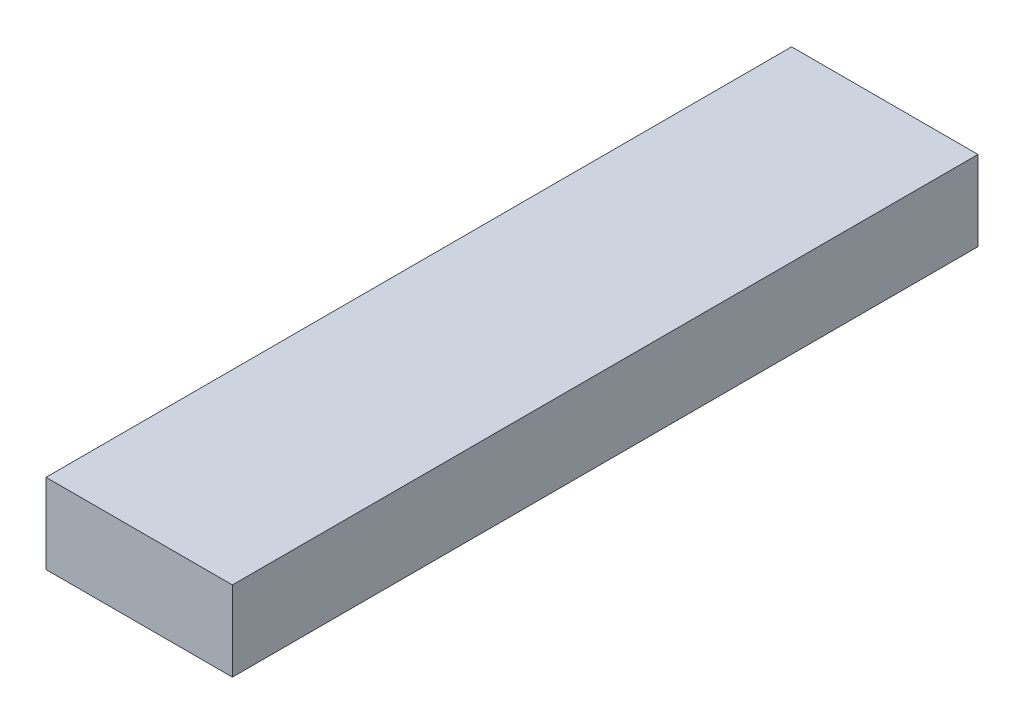
ISO-10303-21;
HEADER;
FILE_DESCRIPTION(('STEP AP214'),'2;1');
FILE_NAME('part.step','',(''),(''),'','','');
FILE_SCHEMA(('AUTOMOTIVE_DESIGN { 1 0 10303 214 1 1 1 1 }'));
ENDSEC;
DATA;
#1=APPLICATION_CONTEXT('core data for automotive mechanical design processes');
#2=APPLICATION_PROTOCOL_DEFINITION('international standard','automotive_design',2000,#1);
#3=PRODUCT_CONTEXT('',#1,'mechanical');
#4=PRODUCT('Part','Part','',(#3));
#5=PRODUCT_RELATED_PRODUCT_CATEGORY('part','',(#4));
#6=PRODUCT_DEFINITION_FORMATION('','',#4);
#7=PRODUCT_DEFINITION_CONTEXT('part definition',#1,'design');
#8=PRODUCT_DEFINITION('design','',#6,#7);
#9=PRODUCT_DEFINITION_SHAPE('','',#8);
#10=(LENGTH_UNIT() NAMED_UNIT(*) SI_UNIT(.MILLI.,.METRE.));
#11=(NAMED_UNIT(*) PLANE_ANGLE_UNIT() SI_UNIT($,.RADIAN.));
#12=(NAMED_UNIT(*) SI_UNIT($,.STERADIAN.) SOLID_ANGLE_UNIT());
#13=UNCERTAINTY_MEASURE_WITH_UNIT(LENGTH_MEASURE(1.E-05),#10,'distance_accuracy_value','');
#14=(GEOMETRIC_REPRESENTATION_CONTEXT(3) GLOBAL_UNCERTAINTY_ASSIGNED_CONTEXT((#13)) GLOBAL_UNIT_ASSIGNED_CONTEXT((#10,
#11,#12)) REPRESENTATION_CONTEXT('',''));
#15=CARTESIAN_POINT('',(0.,0.,0.));
#16=DIRECTION('',(0.,0.,1.));
#17=DIRECTION('',(1.,0.,0.));
#18=AXIS2_PLACEMENT_3D('',#15,#16,#17);
#19=CARTESIAN_POINT('',(0.,0.,355.6));
#20=DIRECTION('',(1.,0.,0.));
#21=DIRECTION('',(0.,0.,-1.));
#22=AXIS2_PLACEMENT_3D('',#19,#20,#21);
#23=PLANE('',#22);
#24=DIRECTION('',(0.,-1.,0.));
#25=VECTOR('',#24,1.);
#26=CARTESIAN_POINT('',(0.,0.,0.));
#27=LINE('',#26,#25);
#28=CARTESIAN_POINT('',(0.,38.1,0.));
#29=VERTEX_POINT('',#28);
#30=CARTESIAN_POINT('',(0.,0.,0.));
#31=VERTEX_POINT('',#30);
#32=EDGE_CURVE('E98',#29,#31,#27,.T.);
#33=ORIENTED_EDGE('',*,*,#32,.T.);
#34=DIRECTION('',(0.,0.,-1.));
#35=VECTOR('',#34,1.);
#36=CARTESIAN_POINT('',(0.,0.,355.6));
#37=LINE('',#36,#35);
#38=CARTESIAN_POINT('',(0.,0.,355.6));
#39=VERTEX_POINT('',#38);
#40=EDGE_CURVE('E11',#39,#31,#37,.T.);
#41=ORIENTED_EDGE('',*,*,#40,.F.);
#42=DIRECTION('',(0.,-1.,0.));
#43=VECTOR('',#42,1.);
#44=CARTESIAN_POINT('',(0.,0.,355.6));
#45=LINE('',#44,#43);
#46=CARTESIAN_POINT('',(0.,38.1,355.6));
#47=VERTEX_POINT('',#46);
#48=EDGE_CURVE('E86',#47,#39,#45,.T.);
#49=ORIENTED_EDGE('',*,*,#48,.F.);
#50=DIRECTION('',(0.,0.,-1.));
#51=VECTOR('',#50,1.);
#52=CARTESIAN_POINT('',(0.,38.1,355.6));
#53=LINE('',#52,#51);
#54=EDGE_CURVE('E94',#47,#29,#53,.T.);
#55=ORIENTED_EDGE('',*,*,#54,.T.);
#56=EDGE_LOOP('',(#33,#41,#49,#55));
#57=FACE_BOUND('',#56,.T.);
#58=ADVANCED_FACE('F35',(#57),#23,.F.);
#59=CARTESIAN_POINT('',(0.,0.,355.6));
#60=DIRECTION('',(0.,1.,0.));
#61=DIRECTION('',(0.,0.,1.));
#62=AXIS2_PLACEMENT_3D('',#59,#60,#61);
#63=PLANE('',#62);
#64=DIRECTION('',(1.,0.,0.));
#65=VECTOR('',#64,1.);
#66=CARTESIAN_POINT('',(0.,0.,0.));
#67=LINE('',#66,#65);
#68=CARTESIAN_POINT('',(88.9,0.,0.));
#69=VERTEX_POINT('',#68);
#70=EDGE_CURVE('E90',#31,#69,#67,.T.);
#71=ORIENTED_EDGE('',*,*,#70,.T.);
#72=DIRECTION('',(0.,0.,-1.));
#73=VECTOR('',#72,1.);
#74=CARTESIAN_POINT('',(88.9,0.,355.6));
#75=LINE('',#74,#73);
#76=CARTESIAN_POINT('',(88.9,0.,355.6));
#77=VERTEX_POINT('',#76);
#78=EDGE_CURVE('E43',#77,#69,#75,.T.);
#79=ORIENTED_EDGE('',*,*,#78,.F.);
#80=DIRECTION('',(1.,0.,0.));
#81=VECTOR('',#80,1.);
#82=CARTESIAN_POINT('',(0.,0.,355.6));
#83=LINE('',#82,#81);
#84=EDGE_CURVE('E81',#39,#77,#83,.T.);
#85=ORIENTED_EDGE('',*,*,#84,.F.);
#86=ORIENTED_EDGE('',*,*,#40,.T.);
#87=EDGE_LOOP('',(#71,#79,#85,#86));
#88=FACE_BOUND('',#87,.T.);
#89=ADVANCED_FACE('F89',(#88),#63,.F.);
#90=CARTESIAN_POINT('',(88.9,0.,355.6));
#91=DIRECTION('',(-1.,0.,0.));
#92=DIRECTION('',(0.,0.,1.));
#93=AXIS2_PLACEMENT_3D('',#90,#91,#92);
#94=PLANE('',#93);
#95=DIRECTION('',(0.,1.,0.));
#96=VECTOR('',#95,1.);
#97=CARTESIAN_POINT('',(88.9,0.,0.));
#98=LINE('',#97,#96);
#99=CARTESIAN_POINT('',(88.9,38.1,0.));
#100=VERTEX_POINT('',#99);
#101=EDGE_CURVE('E68',#69,#100,#98,.T.);
#102=ORIENTED_EDGE('',*,*,#101,.T.);
#103=DIRECTION('',(0.,0.,-1.));
#104=VECTOR('',#103,1.);
#105=CARTESIAN_POINT('',(88.9,38.1,355.6));
#106=LINE('',#105,#104);
#107=CARTESIAN_POINT('',(88.9,38.1,355.6));
#108=VERTEX_POINT('',#107);
#109=EDGE_CURVE('E91',#108,#100,#106,.T.);
#110=ORIENTED_EDGE('',*,*,#109,.F.);
#111=DIRECTION('',(0.,1.,0.));
#112=VECTOR('',#111,1.);
#113=CARTESIAN_POINT('',(88.9,0.,355.6));
#114=LINE('',#113,#112);
#115=EDGE_CURVE('E84',#77,#108,#114,.T.);
#116=ORIENTED_EDGE('',*,*,#115,.F.);
#117=ORIENTED_EDGE('',*,*,#78,.T.);
#118=EDGE_LOOP('',(#102,#110,#116,#117));
#119=FACE_BOUND('',#118,.T.);
#120=ADVANCED_FACE('F92',(#119),#94,.F.);
#121=CARTESIAN_POINT('',(0.,38.1,355.6));
#122=DIRECTION('',(0.,-1.,0.));
#123=DIRECTION('',(0.,0.,-1.));
#124=AXIS2_PLACEMENT_3D('',#121,#122,#123);
#125=PLANE('',#124);
#126=DIRECTION('',(-1.,0.,0.));
#127=VECTOR('',#126,1.);
#128=CARTESIAN_POINT('',(0.,38.1,0.));
#129=LINE('',#128,#127);
#130=EDGE_CURVE('E74',#100,#29,#129,.T.);
#131=ORIENTED_EDGE('',*,*,#130,.T.);
#132=ORIENTED_EDGE('',*,*,#54,.F.);
#133=DIRECTION('',(-1.,0.,0.));
#134=VECTOR('',#133,1.);
#135=CARTESIAN_POINT('',(0.,38.1,355.6));
#136=LINE('',#135,#134);
#137=EDGE_CURVE('E51',#108,#47,#136,.T.);
#138=ORIENTED_EDGE('',*,*,#137,.F.);
#139=ORIENTED_EDGE('',*,*,#109,.T.);
#140=EDGE_LOOP('',(#131,#132,#138,#139));
#141=FACE_BOUND('',#140,.T.);
#142=ADVANCED_FACE('F105',(#141),#125,.F.);
#143=CARTESIAN_POINT('',(0.,0.,355.6));
#144=DIRECTION('',(0.,0.,-1.));
#145=DIRECTION('',(-1.,0.,0.));
#146=AXIS2_PLACEMENT_3D('',#143,#144,#145);
#147=PLANE('',#146);
#148=ORIENTED_EDGE('',*,*,#48,.T.);
#149=ORIENTED_EDGE('',*,*,#84,.T.);
#150=ORIENTED_EDGE('',*,*,#115,.T.);
#151=ORIENTED_EDGE('',*,*,#137,.T.);
#152=EDGE_LOOP('',(#148,#149,#150,#151));
#153=FACE_BOUND('',#152,.T.);
#154=ADVANCED_FACE('F82',(#153),#147,.F.);
#155=CARTESIAN_POINT('',(0.,0.,0.));
#156=DIRECTION('',(0.,0.,-1.));
#157=DIRECTION('',(-1.,0.,0.));
#158=AXIS2_PLACEMENT_3D('',#155,#156,#157);
#159=PLANE('',#158);
#160=ORIENTED_EDGE('',*,*,#32,.F.);
#161=ORIENTED_EDGE('',*,*,#130,.F.);
#162=ORIENTED_EDGE('',*,*,#101,.F.);
#163=ORIENTED_EDGE('',*,*,#70,.F.);
#164=EDGE_LOOP('',(#160,#161,#162,#163));
#165=FACE_BOUND('',#164,.T.);
#166=ADVANCED_FACE('F108',(#165),#159,.T.);
#167=CLOSED_SHELL('',(#58,#89,#120,#142,#154,#166));
#168=MANIFOLD_SOLID_BREP('B2',#167);
#169=ADVANCED_BREP_SHAPE_REPRESENTATION('',(#18,#168),#14);
#170=SHAPE_DEFINITION_REPRESENTATION(#9,#169);
ENDSEC;
END-ISO-10303-21;
